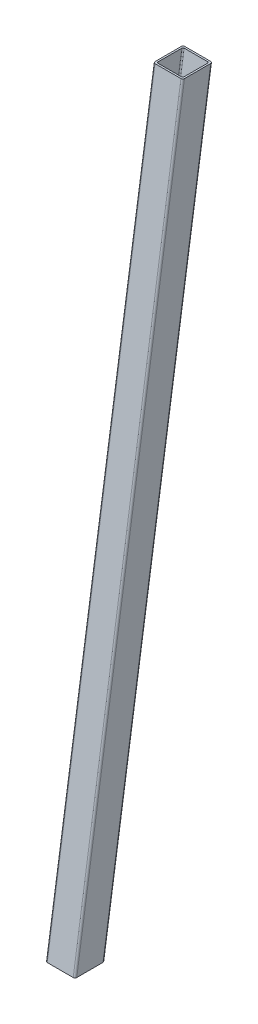
ISO-10303-21;
HEADER;
FILE_DESCRIPTION(('STEP AP214'),'2;1');
FILE_NAME('part.step','',(''),(''),'','','');
FILE_SCHEMA(('AUTOMOTIVE_DESIGN { 1 0 10303 214 1 1 1 1 }'));
ENDSEC;
DATA;
#1=APPLICATION_CONTEXT('core data for automotive mechanical design processes');
#2=APPLICATION_PROTOCOL_DEFINITION('international standard','automotive_design',2000,#1);
#3=PRODUCT_CONTEXT('',#1,'mechanical');
#4=PRODUCT('Part','Part','',(#3));
#5=PRODUCT_RELATED_PRODUCT_CATEGORY('part','',(#4));
#6=PRODUCT_DEFINITION_FORMATION('','',#4);
#7=PRODUCT_DEFINITION_CONTEXT('part definition',#1,'design');
#8=PRODUCT_DEFINITION('design','',#6,#7);
#9=PRODUCT_DEFINITION_SHAPE('','',#8);
#10=(LENGTH_UNIT() NAMED_UNIT(*) SI_UNIT(.MILLI.,.METRE.));
#11=(NAMED_UNIT(*) PLANE_ANGLE_UNIT() SI_UNIT($,.RADIAN.));
#12=(NAMED_UNIT(*) SI_UNIT($,.STERADIAN.) SOLID_ANGLE_UNIT());
#13=UNCERTAINTY_MEASURE_WITH_UNIT(LENGTH_MEASURE(1.E-05),#10,'distance_accuracy_value','');
#14=(GEOMETRIC_REPRESENTATION_CONTEXT(3) GLOBAL_UNCERTAINTY_ASSIGNED_CONTEXT((#13)) GLOBAL_UNIT_ASSIGNED_CONTEXT((#10,
#11,#12)) REPRESENTATION_CONTEXT('',''));
#15=CARTESIAN_POINT('',(0.,0.,0.));
#16=DIRECTION('',(0.,0.,1.));
#17=DIRECTION('',(1.,0.,0.));
#18=AXIS2_PLACEMENT_3D('',#15,#16,#17);
#19=CARTESIAN_POINT('',(5144.,2607.12232892043,4206.38635913862));
#20=DIRECTION('',(0.,-0.989131438478668,0.147034000874356));
#21=DIRECTION('',(0.,-0.147034000874356,-0.989131438478668));
#22=AXIS2_PLACEMENT_3D('',#19,#20,#21);
#23=CYLINDRICAL_SURFACE('',#22,5.99999999999991);
#24=CARTESIAN_POINT('',(5144.,0.,4593.93407208932));
#25=DIRECTION('',(0.,1.,0.));
#26=DIRECTION('',(0.,0.,1.));
#27=AXIS2_PLACEMENT_3D('',#24,#25,#26);
#28=ELLIPSE('',#27,6.06592791068111,5.99999999999991);
#29=CARTESIAN_POINT('',(5150.,0.,4593.93407208932));
#30=VERTEX_POINT('',#29);
#31=CARTESIAN_POINT('',(5144.,1.11022302462516E-13,4600.));
#32=VERTEX_POINT('',#31);
#33=EDGE_CURVE('E55',#30,#32,#28,.F.);
#34=ORIENTED_EDGE('',*,*,#33,.F.);
#35=DIRECTION('',(0.,-0.989131438478668,0.147034000874356));
#36=VECTOR('',#35,1.);
#37=CARTESIAN_POINT('',(5150.,2607.12232892043,4206.38635913862));
#38=LINE('',#37,#36);
#39=CARTESIAN_POINT('',(5150.,2460.,4228.25603570294));
#40=VERTEX_POINT('',#39);
#41=EDGE_CURVE('E212',#40,#30,#38,.T.);
#42=ORIENTED_EDGE('',*,*,#41,.F.);
#43=CARTESIAN_POINT('',(5144.,2460.,4228.25603570294));
#44=DIRECTION('',(0.,1.,0.));
#45=DIRECTION('',(0.,0.,1.));
#46=AXIS2_PLACEMENT_3D('',#43,#44,#45);
#47=ELLIPSE('',#46,6.06592791068111,5.99999999999991);
#48=CARTESIAN_POINT('',(5144.,2460.,4234.32196361362));
#49=VERTEX_POINT('',#48);
#50=EDGE_CURVE('E205',#40,#49,#47,.F.);
#51=ORIENTED_EDGE('',*,*,#50,.T.);
#52=DIRECTION('',(0.,-0.989131438478668,0.147034000874356));
#53=VECTOR('',#52,1.);
#54=CARTESIAN_POINT('',(5144.,2608.00453292568,4212.32114776949));
#55=LINE('',#54,#53);
#56=EDGE_CURVE('E208',#49,#32,#55,.T.);
#57=ORIENTED_EDGE('',*,*,#56,.T.);
#58=EDGE_LOOP('',(#34,#42,#51,#57));
#59=FACE_BOUND('',#58,.T.);
#60=ADVANCED_FACE('F38',(#59),#23,.T.);
#61=CARTESIAN_POINT('',(5150.,2594.18333684349,4119.3427925525));
#62=DIRECTION('',(1.,0.,0.));
#63=DIRECTION('',(0.,0.,-1.));
#64=AXIS2_PLACEMENT_3D('',#61,#62,#63);
#65=PLANE('',#64);
#66=DIRECTION('',(0.,0.,1.));
#67=VECTOR('',#66,1.);
#68=CARTESIAN_POINT('',(5150.,0.,4119.3427925525));
#69=LINE('',#68,#67);
#70=CARTESIAN_POINT('',(5150.,0.,4504.96712939933));
#71=VERTEX_POINT('',#70);
#72=EDGE_CURVE('E62',#71,#30,#69,.T.);
#73=ORIENTED_EDGE('',*,*,#72,.F.);
#74=DIRECTION('',(0.,-0.989131438478668,0.147034000874356));
#75=VECTOR('',#74,1.);
#76=CARTESIAN_POINT('',(5150.,2594.18333684349,4119.3427925525));
#77=LINE('',#76,#75);
#78=CARTESIAN_POINT('',(5150.,2460.,4139.28909301295));
#79=VERTEX_POINT('',#78);
#80=EDGE_CURVE('E216',#79,#71,#77,.T.);
#81=ORIENTED_EDGE('',*,*,#80,.F.);
#82=DIRECTION('',(0.,0.,1.));
#83=VECTOR('',#82,1.);
#84=CARTESIAN_POINT('',(5150.,2460.,4119.3427925525));
#85=LINE('',#84,#83);
#86=EDGE_CURVE('E209',#79,#40,#85,.T.);
#87=ORIENTED_EDGE('',*,*,#86,.T.);
#88=ORIENTED_EDGE('',*,*,#41,.T.);
#89=EDGE_LOOP('',(#73,#81,#87,#88));
#90=FACE_BOUND('',#89,.T.);
#91=ADVANCED_FACE('F317',(#90),#65,.T.);
#92=CARTESIAN_POINT('',(5144.,2594.18333684349,4119.3427925525));
#93=DIRECTION('',(0.,-0.989131438478668,0.147034000874356));
#94=DIRECTION('',(0.,-0.147034000874356,-0.989131438478668));
#95=AXIS2_PLACEMENT_3D('',#92,#93,#94);
#96=CYLINDRICAL_SURFACE('',#95,5.99999999999991);
#97=CARTESIAN_POINT('',(5144.,0.,4504.96712939933));
#98=DIRECTION('',(0.,1.,0.));
#99=DIRECTION('',(0.,0.,1.));
#100=AXIS2_PLACEMENT_3D('',#97,#98,#99);
#101=ELLIPSE('',#100,6.06592791068111,5.99999999999991);
#102=CARTESIAN_POINT('',(5144.,-4.44089209850063E-13,4498.90120148865));
#103=VERTEX_POINT('',#102);
#104=EDGE_CURVE('E354',#103,#71,#101,.F.);
#105=ORIENTED_EDGE('',*,*,#104,.F.);
#106=DIRECTION('',(0.,-0.989131438478668,0.147034000874356));
#107=VECTOR('',#106,1.);
#108=CARTESIAN_POINT('',(5144.,2593.30113283824,4113.40800392163));
#109=LINE('',#108,#107);
#110=CARTESIAN_POINT('',(5144.,2460.,4133.22316510227));
#111=VERTEX_POINT('',#110);
#112=EDGE_CURVE('E220',#111,#103,#109,.T.);
#113=ORIENTED_EDGE('',*,*,#112,.F.);
#114=CARTESIAN_POINT('',(5144.,2460.,4139.28909301295));
#115=DIRECTION('',(0.,1.,0.));
#116=DIRECTION('',(0.,0.,1.));
#117=AXIS2_PLACEMENT_3D('',#114,#115,#116);
#118=ELLIPSE('',#117,6.06592791068111,5.99999999999991);
#119=EDGE_CURVE('E213',#111,#79,#118,.F.);
#120=ORIENTED_EDGE('',*,*,#119,.T.);
#121=ORIENTED_EDGE('',*,*,#80,.T.);
#122=EDGE_LOOP('',(#105,#113,#120,#121));
#123=FACE_BOUND('',#122,.T.);
#124=ADVANCED_FACE('F322',(#123),#96,.T.);
#125=CARTESIAN_POINT('',(5144.,2593.30113283824,4113.40800392163));
#126=DIRECTION('',(0.,-0.147034000874356,-0.989131438478668));
#127=DIRECTION('',(0.,0.989131438478668,-0.147034000874356));
#128=AXIS2_PLACEMENT_3D('',#125,#126,#127);
#129=PLANE('',#128);
#130=DIRECTION('',(1.,0.,0.));
#131=VECTOR('',#130,1.);
#132=CARTESIAN_POINT('',(5144.,0.,4498.90120148865));
#133=LINE('',#132,#131);
#134=CARTESIAN_POINT('',(5056.,0.,4498.90120148865));
#135=VERTEX_POINT('',#134);
#136=EDGE_CURVE('E343',#135,#103,#133,.T.);
#137=ORIENTED_EDGE('',*,*,#136,.F.);
#138=DIRECTION('',(0.,-0.989131438478668,0.147034000874356));
#139=VECTOR('',#138,1.);
#140=CARTESIAN_POINT('',(5056.,2593.30113283824,4113.40800392163));
#141=LINE('',#140,#139);
#142=CARTESIAN_POINT('',(5056.,2460.,4133.22316510227));
#143=VERTEX_POINT('',#142);
#144=EDGE_CURVE('E224',#143,#135,#141,.T.);
#145=ORIENTED_EDGE('',*,*,#144,.F.);
#146=DIRECTION('',(1.,0.,0.));
#147=VECTOR('',#146,1.);
#148=CARTESIAN_POINT('',(5144.,2460.,4133.22316510227));
#149=LINE('',#148,#147);
#150=EDGE_CURVE('E217',#143,#111,#149,.T.);
#151=ORIENTED_EDGE('',*,*,#150,.T.);
#152=ORIENTED_EDGE('',*,*,#112,.T.);
#153=EDGE_LOOP('',(#137,#145,#151,#152));
#154=FACE_BOUND('',#153,.T.);
#155=ADVANCED_FACE('F341',(#154),#129,.T.);
#156=CARTESIAN_POINT('',(5056.,2594.18333684349,4119.3427925525));
#157=DIRECTION('',(0.,-0.989131438478668,0.147034000874356));
#158=DIRECTION('',(0.,-0.147034000874356,-0.989131438478668));
#159=AXIS2_PLACEMENT_3D('',#156,#157,#158);
#160=CYLINDRICAL_SURFACE('',#159,5.99999999999991);
#161=CARTESIAN_POINT('',(5056.,0.,4504.96712939933));
#162=DIRECTION('',(0.,1.,0.));
#163=DIRECTION('',(0.,0.,1.));
#164=AXIS2_PLACEMENT_3D('',#161,#162,#163);
#165=ELLIPSE('',#164,6.06592791068111,5.99999999999991);
#166=CARTESIAN_POINT('',(5050.,2.22044604925031E-13,4504.96712939933));
#167=VERTEX_POINT('',#166);
#168=EDGE_CURVE('E347',#167,#135,#165,.F.);
#169=ORIENTED_EDGE('',*,*,#168,.F.);
#170=DIRECTION('',(0.,-0.989131438478668,0.147034000874356));
#171=VECTOR('',#170,1.);
#172=CARTESIAN_POINT('',(5050.,2594.18333684349,4119.3427925525));
#173=LINE('',#172,#171);
#174=CARTESIAN_POINT('',(5050.,2460.,4139.28909301295));
#175=VERTEX_POINT('',#174);
#176=EDGE_CURVE('E228',#175,#167,#173,.T.);
#177=ORIENTED_EDGE('',*,*,#176,.F.);
#178=CARTESIAN_POINT('',(5056.,2460.,4139.28909301295));
#179=DIRECTION('',(0.,1.,0.));
#180=DIRECTION('',(0.,0.,1.));
#181=AXIS2_PLACEMENT_3D('',#178,#179,#180);
#182=ELLIPSE('',#181,6.06592791068111,5.99999999999991);
#183=EDGE_CURVE('E221',#175,#143,#182,.F.);
#184=ORIENTED_EDGE('',*,*,#183,.T.);
#185=ORIENTED_EDGE('',*,*,#144,.T.);
#186=EDGE_LOOP('',(#169,#177,#184,#185));
#187=FACE_BOUND('',#186,.T.);
#188=ADVANCED_FACE('F346',(#187),#160,.T.);
#189=CARTESIAN_POINT('',(5050.,2594.18333684349,4119.3427925525));
#190=DIRECTION('',(-1.,0.,0.));
#191=DIRECTION('',(0.,0.,1.));
#192=AXIS2_PLACEMENT_3D('',#189,#190,#191);
#193=PLANE('',#192);
#194=DIRECTION('',(0.,0.,-1.));
#195=VECTOR('',#194,1.);
#196=CARTESIAN_POINT('',(5050.,0.,4119.3427925525));
#197=LINE('',#196,#195);
#198=CARTESIAN_POINT('',(5050.,0.,4593.93407208932));
#199=VERTEX_POINT('',#198);
#200=EDGE_CURVE('E175',#199,#167,#197,.T.);
#201=ORIENTED_EDGE('',*,*,#200,.F.);
#202=DIRECTION('',(0.,-0.989131438478668,0.147034000874356));
#203=VECTOR('',#202,1.);
#204=CARTESIAN_POINT('',(5050.,2607.12232892043,4206.38635913862));
#205=LINE('',#204,#203);
#206=CARTESIAN_POINT('',(5050.,2460.,4228.25603570294));
#207=VERTEX_POINT('',#206);
#208=EDGE_CURVE('E172',#207,#199,#205,.T.);
#209=ORIENTED_EDGE('',*,*,#208,.F.);
#210=DIRECTION('',(0.,0.,-1.));
#211=VECTOR('',#210,1.);
#212=CARTESIAN_POINT('',(5050.,2460.,4119.3427925525));
#213=LINE('',#212,#211);
#214=EDGE_CURVE('E225',#207,#175,#213,.T.);
#215=ORIENTED_EDGE('',*,*,#214,.T.);
#216=ORIENTED_EDGE('',*,*,#176,.T.);
#217=EDGE_LOOP('',(#201,#209,#215,#216));
#218=FACE_BOUND('',#217,.T.);
#219=ADVANCED_FACE('F349',(#218),#193,.T.);
#220=CARTESIAN_POINT('',(5056.,2607.12232892043,4206.38635913862));
#221=DIRECTION('',(0.,-0.989131438478668,0.147034000874356));
#222=DIRECTION('',(0.,-0.147034000874356,-0.989131438478668));
#223=AXIS2_PLACEMENT_3D('',#220,#221,#222);
#224=CYLINDRICAL_SURFACE('',#223,5.99999999999991);
#225=CARTESIAN_POINT('',(5056.,0.,4593.93407208932));
#226=DIRECTION('',(0.,1.,0.));
#227=DIRECTION('',(0.,0.,1.));
#228=AXIS2_PLACEMENT_3D('',#225,#226,#227);
#229=ELLIPSE('',#228,6.06592791068111,5.99999999999991);
#230=CARTESIAN_POINT('',(5056.,0.,4600.));
#231=VERTEX_POINT('',#230);
#232=EDGE_CURVE('E169',#231,#199,#229,.F.);
#233=ORIENTED_EDGE('',*,*,#232,.F.);
#234=DIRECTION('',(0.,-0.989131438478668,0.147034000874356));
#235=VECTOR('',#234,1.);
#236=CARTESIAN_POINT('',(5056.,2608.00453292568,4212.32114776949));
#237=LINE('',#236,#235);
#238=CARTESIAN_POINT('',(5056.,2460.,4234.32196361362));
#239=VERTEX_POINT('',#238);
#240=EDGE_CURVE('E156',#239,#231,#237,.T.);
#241=ORIENTED_EDGE('',*,*,#240,.F.);
#242=CARTESIAN_POINT('',(5056.,2460.,4228.25603570294));
#243=DIRECTION('',(0.,1.,0.));
#244=DIRECTION('',(0.,0.,1.));
#245=AXIS2_PLACEMENT_3D('',#242,#243,#244);
#246=ELLIPSE('',#245,6.06592791068111,5.99999999999991);
#247=EDGE_CURVE('E229',#239,#207,#246,.F.);
#248=ORIENTED_EDGE('',*,*,#247,.T.);
#249=ORIENTED_EDGE('',*,*,#208,.T.);
#250=EDGE_LOOP('',(#233,#241,#248,#249));
#251=FACE_BOUND('',#250,.T.);
#252=ADVANCED_FACE('F170',(#251),#224,.T.);
#253=CARTESIAN_POINT('',(5144.,2608.00453292568,4212.32114776949));
#254=DIRECTION('',(0.,0.147034000874356,0.989131438478668));
#255=DIRECTION('',(0.,-0.989131438478668,0.147034000874356));
#256=AXIS2_PLACEMENT_3D('',#253,#254,#255);
#257=PLANE('',#256);
#258=ORIENTED_EDGE('',*,*,#56,.F.);
#259=DIRECTION('',(-1.,0.,0.));
#260=VECTOR('',#259,1.);
#261=CARTESIAN_POINT('',(5144.,2460.,4234.32196361362));
#262=LINE('',#261,#260);
#263=EDGE_CURVE('E162',#49,#239,#262,.T.);
#264=ORIENTED_EDGE('',*,*,#263,.T.);
#265=ORIENTED_EDGE('',*,*,#240,.T.);
#266=DIRECTION('',(-1.,0.,0.));
#267=VECTOR('',#266,1.);
#268=CARTESIAN_POINT('',(5144.,1.11022302462516E-13,4600.));
#269=LINE('',#268,#267);
#270=EDGE_CURVE('E161',#32,#231,#269,.T.);
#271=ORIENTED_EDGE('',*,*,#270,.F.);
#272=EDGE_LOOP('',(#258,#264,#265,#271));
#273=FACE_BOUND('',#272,.T.);
#274=ADVANCED_FACE('F159',(#273),#257,.T.);
#275=CARTESIAN_POINT('',(5140.,2606.53419291693,4202.42983338471));
#276=DIRECTION('',(0.,-0.989131438478668,0.147034000874356));
#277=DIRECTION('',(0.,-0.147034000874356,-0.989131438478668));
#278=AXIS2_PLACEMENT_3D('',#275,#276,#277);
#279=CYLINDRICAL_SURFACE('',#278,3.99999999999979);
#280=DIRECTION('',(0.,-0.989131438478668,0.147034000874356));
#281=VECTOR('',#280,1.);
#282=CARTESIAN_POINT('',(5144.,2606.53419291693,4202.42983338471));
#283=LINE('',#282,#281);
#284=CARTESIAN_POINT('',(5144.,2460.,4224.21208376248));
#285=VERTEX_POINT('',#284);
#286=CARTESIAN_POINT('',(5144.,0.,4589.89012014887));
#287=VERTEX_POINT('',#286);
#288=EDGE_CURVE('E165',#285,#287,#283,.T.);
#289=ORIENTED_EDGE('',*,*,#288,.T.);
#290=CARTESIAN_POINT('',(5140.,0.,4589.89012014887));
#291=DIRECTION('',(0.,1.,0.));
#292=DIRECTION('',(0.,0.,1.));
#293=AXIS2_PLACEMENT_3D('',#290,#291,#292);
#294=ELLIPSE('',#293,4.04395194045392,3.99999999999979);
#295=CARTESIAN_POINT('',(5140.,0.,4593.93407208932));
#296=VERTEX_POINT('',#295);
#297=EDGE_CURVE('E188',#287,#296,#294,.F.);
#298=ORIENTED_EDGE('',*,*,#297,.T.);
#299=DIRECTION('',(0.,-0.989131438478668,0.147034000874356));
#300=VECTOR('',#299,1.);
#301=CARTESIAN_POINT('',(5140.,2607.12232892043,4206.38635913862));
#302=LINE('',#301,#300);
#303=CARTESIAN_POINT('',(5140.,2460.,4228.25603570294));
#304=VERTEX_POINT('',#303);
#305=EDGE_CURVE('E42',#304,#296,#302,.T.);
#306=ORIENTED_EDGE('',*,*,#305,.F.);
#307=CARTESIAN_POINT('',(5140.,2460.,4224.21208376248));
#308=DIRECTION('',(0.,1.,0.));
#309=DIRECTION('',(0.,0.,1.));
#310=AXIS2_PLACEMENT_3D('',#307,#308,#309);
#311=ELLIPSE('',#310,4.04395194045392,3.99999999999979);
#312=EDGE_CURVE('E182',#285,#304,#311,.F.);
#313=ORIENTED_EDGE('',*,*,#312,.F.);
#314=EDGE_LOOP('',(#289,#298,#306,#313));
#315=FACE_BOUND('',#314,.T.);
#316=ADVANCED_FACE('F293',(#315),#279,.F.);
#317=CARTESIAN_POINT('',(5144.,2594.77147284699,4123.29931830641));
#318=DIRECTION('',(1.,0.,0.));
#319=DIRECTION('',(0.,0.,-1.));
#320=AXIS2_PLACEMENT_3D('',#317,#318,#319);
#321=PLANE('',#320);
#322=DIRECTION('',(0.,-0.989131438478668,0.147034000874356));
#323=VECTOR('',#322,1.);
#324=CARTESIAN_POINT('',(5144.,2594.77147284699,4123.29931830641));
#325=LINE('',#324,#323);
#326=CARTESIAN_POINT('',(5144.,2460.,4143.3330449534));
#327=VERTEX_POINT('',#326);
#328=CARTESIAN_POINT('',(5144.,0.,4509.01108133978));
#329=VERTEX_POINT('',#328);
#330=EDGE_CURVE('E245',#327,#329,#325,.T.);
#331=ORIENTED_EDGE('',*,*,#330,.T.);
#332=DIRECTION('',(0.,0.,1.));
#333=VECTOR('',#332,1.);
#334=CARTESIAN_POINT('',(5144.,0.,4123.29931830641));
#335=LINE('',#334,#333);
#336=EDGE_CURVE('E288',#329,#287,#335,.T.);
#337=ORIENTED_EDGE('',*,*,#336,.T.);
#338=ORIENTED_EDGE('',*,*,#288,.F.);
#339=DIRECTION('',(0.,0.,1.));
#340=VECTOR('',#339,1.);
#341=CARTESIAN_POINT('',(5144.,2460.,4123.29931830641));
#342=LINE('',#341,#340);
#343=EDGE_CURVE('E179',#327,#285,#342,.T.);
#344=ORIENTED_EDGE('',*,*,#343,.F.);
#345=EDGE_LOOP('',(#331,#337,#338,#344));
#346=FACE_BOUND('',#345,.T.);
#347=ADVANCED_FACE('F298',(#346),#321,.F.);
#348=CARTESIAN_POINT('',(5140.,2594.77147284699,4123.29931830641));
#349=DIRECTION('',(0.,-0.989131438478668,0.147034000874356));
#350=DIRECTION('',(0.,-0.147034000874356,-0.989131438478668));
#351=AXIS2_PLACEMENT_3D('',#348,#349,#350);
#352=CYLINDRICAL_SURFACE('',#351,3.99999999999979);
#353=DIRECTION('',(0.,-0.989131438478668,0.147034000874356));
#354=VECTOR('',#353,1.);
#355=CARTESIAN_POINT('',(5140.,2594.18333684349,4119.3427925525));
#356=LINE('',#355,#354);
#357=CARTESIAN_POINT('',(5140.,2460.,4139.28909301295));
#358=VERTEX_POINT('',#357);
#359=CARTESIAN_POINT('',(5140.,0.,4504.96712939933));
#360=VERTEX_POINT('',#359);
#361=EDGE_CURVE('E248',#358,#360,#356,.T.);
#362=ORIENTED_EDGE('',*,*,#361,.T.);
#363=CARTESIAN_POINT('',(5140.,0.,4509.01108133978));
#364=DIRECTION('',(0.,1.,0.));
#365=DIRECTION('',(0.,0.,1.));
#366=AXIS2_PLACEMENT_3D('',#363,#364,#365);
#367=ELLIPSE('',#366,4.04395194045392,3.99999999999979);
#368=EDGE_CURVE('E286',#360,#329,#367,.F.);
#369=ORIENTED_EDGE('',*,*,#368,.T.);
#370=ORIENTED_EDGE('',*,*,#330,.F.);
#371=CARTESIAN_POINT('',(5140.,2460.,4143.3330449534));
#372=DIRECTION('',(0.,1.,0.));
#373=DIRECTION('',(0.,0.,1.));
#374=AXIS2_PLACEMENT_3D('',#371,#372,#373);
#375=ELLIPSE('',#374,4.04395194045392,3.99999999999979);
#376=EDGE_CURVE('E11',#358,#327,#375,.F.);
#377=ORIENTED_EDGE('',*,*,#376,.F.);
#378=EDGE_LOOP('',(#362,#369,#370,#377));
#379=FACE_BOUND('',#378,.T.);
#380=ADVANCED_FACE('F296',(#379),#352,.F.);
#381=CARTESIAN_POINT('',(5140.,2594.18333684349,4119.3427925525));
#382=DIRECTION('',(0.,-0.147034000874356,-0.989131438478668));
#383=DIRECTION('',(0.,0.989131438478668,-0.147034000874356));
#384=AXIS2_PLACEMENT_3D('',#381,#382,#383);
#385=PLANE('',#384);
#386=DIRECTION('',(0.,-0.989131438478668,0.147034000874356));
#387=VECTOR('',#386,1.);
#388=CARTESIAN_POINT('',(5060.,2594.18333684349,4119.3427925525));
#389=LINE('',#388,#387);
#390=CARTESIAN_POINT('',(5060.,2460.,4139.28909301295));
#391=VERTEX_POINT('',#390);
#392=CARTESIAN_POINT('',(5060.,0.,4504.96712939933));
#393=VERTEX_POINT('',#392);
#394=EDGE_CURVE('E251',#391,#393,#389,.T.);
#395=ORIENTED_EDGE('',*,*,#394,.T.);
#396=DIRECTION('',(1.,0.,0.));
#397=VECTOR('',#396,1.);
#398=CARTESIAN_POINT('',(5140.,0.,4504.96712939933));
#399=LINE('',#398,#397);
#400=EDGE_CURVE('E283',#393,#360,#399,.T.);
#401=ORIENTED_EDGE('',*,*,#400,.T.);
#402=ORIENTED_EDGE('',*,*,#361,.F.);
#403=DIRECTION('',(1.,0.,0.));
#404=VECTOR('',#403,1.);
#405=CARTESIAN_POINT('',(5140.,2460.,4139.28909301295));
#406=LINE('',#405,#404);
#407=EDGE_CURVE('E47',#391,#358,#406,.T.);
#408=ORIENTED_EDGE('',*,*,#407,.F.);
#409=EDGE_LOOP('',(#395,#401,#402,#408));
#410=FACE_BOUND('',#409,.T.);
#411=ADVANCED_FACE('F301',(#410),#385,.F.);
#412=CARTESIAN_POINT('',(5060.,2594.77147284699,4123.29931830641));
#413=DIRECTION('',(0.,-0.989131438478668,0.147034000874356));
#414=DIRECTION('',(0.,-0.147034000874356,-0.989131438478668));
#415=AXIS2_PLACEMENT_3D('',#412,#413,#414);
#416=CYLINDRICAL_SURFACE('',#415,3.99999999999979);
#417=DIRECTION('',(0.,-0.989131438478668,0.147034000874356));
#418=VECTOR('',#417,1.);
#419=CARTESIAN_POINT('',(5056.,2594.77147284699,4123.29931830641));
#420=LINE('',#419,#418);
#421=CARTESIAN_POINT('',(5056.,2460.,4143.3330449534));
#422=VERTEX_POINT('',#421);
#423=CARTESIAN_POINT('',(5056.,0.,4509.01108133978));
#424=VERTEX_POINT('',#423);
#425=EDGE_CURVE('E254',#422,#424,#420,.T.);
#426=ORIENTED_EDGE('',*,*,#425,.T.);
#427=CARTESIAN_POINT('',(5060.,0.,4509.01108133978));
#428=DIRECTION('',(0.,1.,0.));
#429=DIRECTION('',(0.,0.,1.));
#430=AXIS2_PLACEMENT_3D('',#427,#428,#429);
#431=ELLIPSE('',#430,4.04395194045392,3.99999999999979);
#432=EDGE_CURVE('E280',#424,#393,#431,.F.);
#433=ORIENTED_EDGE('',*,*,#432,.T.);
#434=ORIENTED_EDGE('',*,*,#394,.F.);
#435=CARTESIAN_POINT('',(5060.,2460.,4143.3330449534));
#436=DIRECTION('',(0.,1.,0.));
#437=DIRECTION('',(0.,0.,1.));
#438=AXIS2_PLACEMENT_3D('',#435,#436,#437);
#439=ELLIPSE('',#438,4.04395194045392,3.99999999999979);
#440=EDGE_CURVE('E196',#422,#391,#439,.F.);
#441=ORIENTED_EDGE('',*,*,#440,.F.);
#442=EDGE_LOOP('',(#426,#433,#434,#441));
#443=FACE_BOUND('',#442,.T.);
#444=ADVANCED_FACE('F304',(#443),#416,.F.);
#445=CARTESIAN_POINT('',(5056.,2594.77147284699,4123.29931830641));
#446=DIRECTION('',(-1.,0.,0.));
#447=DIRECTION('',(0.,0.,1.));
#448=AXIS2_PLACEMENT_3D('',#445,#446,#447);
#449=PLANE('',#448);
#450=DIRECTION('',(0.,-0.989131438478668,0.147034000874356));
#451=VECTOR('',#450,1.);
#452=CARTESIAN_POINT('',(5056.,2606.53419291693,4202.42983338471));
#453=LINE('',#452,#451);
#454=CARTESIAN_POINT('',(5056.,2460.,4224.21208376248));
#455=VERTEX_POINT('',#454);
#456=CARTESIAN_POINT('',(5056.,0.,4589.89012014887));
#457=VERTEX_POINT('',#456);
#458=EDGE_CURVE('E257',#455,#457,#453,.T.);
#459=ORIENTED_EDGE('',*,*,#458,.T.);
#460=DIRECTION('',(0.,0.,-1.));
#461=VECTOR('',#460,1.);
#462=CARTESIAN_POINT('',(5056.,0.,4123.29931830641));
#463=LINE('',#462,#461);
#464=EDGE_CURVE('E273',#457,#424,#463,.T.);
#465=ORIENTED_EDGE('',*,*,#464,.T.);
#466=ORIENTED_EDGE('',*,*,#425,.F.);
#467=DIRECTION('',(0.,0.,-1.));
#468=VECTOR('',#467,1.);
#469=CARTESIAN_POINT('',(5056.,2460.,4123.29931830641));
#470=LINE('',#469,#468);
#471=EDGE_CURVE('E199',#455,#422,#470,.T.);
#472=ORIENTED_EDGE('',*,*,#471,.F.);
#473=EDGE_LOOP('',(#459,#465,#466,#472));
#474=FACE_BOUND('',#473,.T.);
#475=ADVANCED_FACE('F307',(#474),#449,.F.);
#476=CARTESIAN_POINT('',(5060.,2606.53419291693,4202.42983338471));
#477=DIRECTION('',(0.,-0.989131438478668,0.147034000874356));
#478=DIRECTION('',(0.,-0.147034000874356,-0.989131438478668));
#479=AXIS2_PLACEMENT_3D('',#476,#477,#478);
#480=CYLINDRICAL_SURFACE('',#479,3.99999999999979);
#481=DIRECTION('',(0.,-0.989131438478668,0.147034000874356));
#482=VECTOR('',#481,1.);
#483=CARTESIAN_POINT('',(5060.,2607.12232892043,4206.38635913862));
#484=LINE('',#483,#482);
#485=CARTESIAN_POINT('',(5060.,2460.,4228.25603570294));
#486=VERTEX_POINT('',#485);
#487=CARTESIAN_POINT('',(5060.,-4.44089209850063E-13,4593.93407208932));
#488=VERTEX_POINT('',#487);
#489=EDGE_CURVE('E185',#486,#488,#484,.T.);
#490=ORIENTED_EDGE('',*,*,#489,.T.);
#491=CARTESIAN_POINT('',(5060.,0.,4589.89012014887));
#492=DIRECTION('',(0.,1.,0.));
#493=DIRECTION('',(0.,0.,1.));
#494=AXIS2_PLACEMENT_3D('',#491,#492,#493);
#495=ELLIPSE('',#494,4.04395194045392,3.99999999999979);
#496=EDGE_CURVE('E265',#488,#457,#495,.F.);
#497=ORIENTED_EDGE('',*,*,#496,.T.);
#498=ORIENTED_EDGE('',*,*,#458,.F.);
#499=CARTESIAN_POINT('',(5060.,2460.,4224.21208376248));
#500=DIRECTION('',(0.,1.,0.));
#501=DIRECTION('',(0.,0.,1.));
#502=AXIS2_PLACEMENT_3D('',#499,#500,#501);
#503=ELLIPSE('',#502,4.04395194045392,3.99999999999979);
#504=EDGE_CURVE('E202',#486,#455,#503,.F.);
#505=ORIENTED_EDGE('',*,*,#504,.F.);
#506=EDGE_LOOP('',(#490,#497,#498,#505));
#507=FACE_BOUND('',#506,.T.);
#508=ADVANCED_FACE('F263',(#507),#480,.F.);
#509=CARTESIAN_POINT('',(5140.,2607.12232892043,4206.38635913862));
#510=DIRECTION('',(0.,0.147034000874356,0.989131438478668));
#511=DIRECTION('',(0.,-0.989131438478668,0.147034000874356));
#512=AXIS2_PLACEMENT_3D('',#509,#510,#511);
#513=PLANE('',#512);
#514=ORIENTED_EDGE('',*,*,#305,.T.);
#515=DIRECTION('',(-1.,0.,0.));
#516=VECTOR('',#515,1.);
#517=CARTESIAN_POINT('',(5140.,0.,4593.93407208932));
#518=LINE('',#517,#516);
#519=EDGE_CURVE('E270',#296,#488,#518,.T.);
#520=ORIENTED_EDGE('',*,*,#519,.T.);
#521=ORIENTED_EDGE('',*,*,#489,.F.);
#522=DIRECTION('',(-1.,0.,0.));
#523=VECTOR('',#522,1.);
#524=CARTESIAN_POINT('',(5140.,2460.,4228.25603570294));
#525=LINE('',#524,#523);
#526=EDGE_CURVE('E192',#304,#486,#525,.T.);
#527=ORIENTED_EDGE('',*,*,#526,.F.);
#528=EDGE_LOOP('',(#514,#520,#521,#527));
#529=FACE_BOUND('',#528,.T.);
#530=ADVANCED_FACE('F269',(#529),#513,.F.);
#531=CARTESIAN_POINT('',(5056.,2460.,4369.08780731511));
#532=DIRECTION('',(0.,1.,0.));
#533=DIRECTION('',(0.,0.,1.));
#534=AXIS2_PLACEMENT_3D('',#531,#532,#533);
#535=PLANE('',#534);
#536=ORIENTED_EDGE('',*,*,#50,.F.);
#537=ORIENTED_EDGE('',*,*,#86,.F.);
#538=ORIENTED_EDGE('',*,*,#119,.F.);
#539=ORIENTED_EDGE('',*,*,#150,.F.);
#540=ORIENTED_EDGE('',*,*,#183,.F.);
#541=ORIENTED_EDGE('',*,*,#214,.F.);
#542=ORIENTED_EDGE('',*,*,#247,.F.);
#543=ORIENTED_EDGE('',*,*,#263,.F.);
#544=EDGE_LOOP('',(#536,#537,#538,#539,#540,#541,#542,#543));
#545=FACE_BOUND('',#544,.T.);
#546=ORIENTED_EDGE('',*,*,#343,.T.);
#547=ORIENTED_EDGE('',*,*,#312,.T.);
#548=ORIENTED_EDGE('',*,*,#526,.T.);
#549=ORIENTED_EDGE('',*,*,#504,.T.);
#550=ORIENTED_EDGE('',*,*,#471,.T.);
#551=ORIENTED_EDGE('',*,*,#440,.T.);
#552=ORIENTED_EDGE('',*,*,#407,.T.);
#553=ORIENTED_EDGE('',*,*,#376,.T.);
#554=EDGE_LOOP('',(#546,#547,#548,#549,#550,#551,#552,#553));
#555=FACE_BOUND('',#554,.T.);
#556=ADVANCED_FACE('F40',(#545,#555),#535,.T.);
#557=CARTESIAN_POINT('',(0.,0.,0.));
#558=DIRECTION('',(0.,1.,0.));
#559=DIRECTION('',(0.,0.,1.));
#560=AXIS2_PLACEMENT_3D('',#557,#558,#559);
#561=PLANE('',#560);
#562=ORIENTED_EDGE('',*,*,#72,.T.);
#563=ORIENTED_EDGE('',*,*,#33,.T.);
#564=ORIENTED_EDGE('',*,*,#270,.T.);
#565=ORIENTED_EDGE('',*,*,#232,.T.);
#566=ORIENTED_EDGE('',*,*,#200,.T.);
#567=ORIENTED_EDGE('',*,*,#168,.T.);
#568=ORIENTED_EDGE('',*,*,#136,.T.);
#569=ORIENTED_EDGE('',*,*,#104,.T.);
#570=EDGE_LOOP('',(#562,#563,#564,#565,#566,#567,#568,#569));
#571=FACE_BOUND('',#570,.T.);
#572=ORIENTED_EDGE('',*,*,#297,.F.);
#573=ORIENTED_EDGE('',*,*,#336,.F.);
#574=ORIENTED_EDGE('',*,*,#368,.F.);
#575=ORIENTED_EDGE('',*,*,#400,.F.);
#576=ORIENTED_EDGE('',*,*,#432,.F.);
#577=ORIENTED_EDGE('',*,*,#464,.F.);
#578=ORIENTED_EDGE('',*,*,#496,.F.);
#579=ORIENTED_EDGE('',*,*,#519,.F.);
#580=EDGE_LOOP('',(#572,#573,#574,#575,#576,#577,#578,#579));
#581=FACE_BOUND('',#580,.T.);
#582=ADVANCED_FACE('F177',(#571,#581),#561,.F.);
#583=CLOSED_SHELL('',(#60,#91,#124,#155,#188,#219,#252,#274,#316,#347,#380,#411,#444,#475,#508,
#530,#556,#582));
#584=MANIFOLD_SOLID_BREP('B2',#583);
#585=ADVANCED_BREP_SHAPE_REPRESENTATION('',(#18,#584),#14);
#586=SHAPE_DEFINITION_REPRESENTATION(#9,#585);
ENDSEC;
END-ISO-10303-21;
